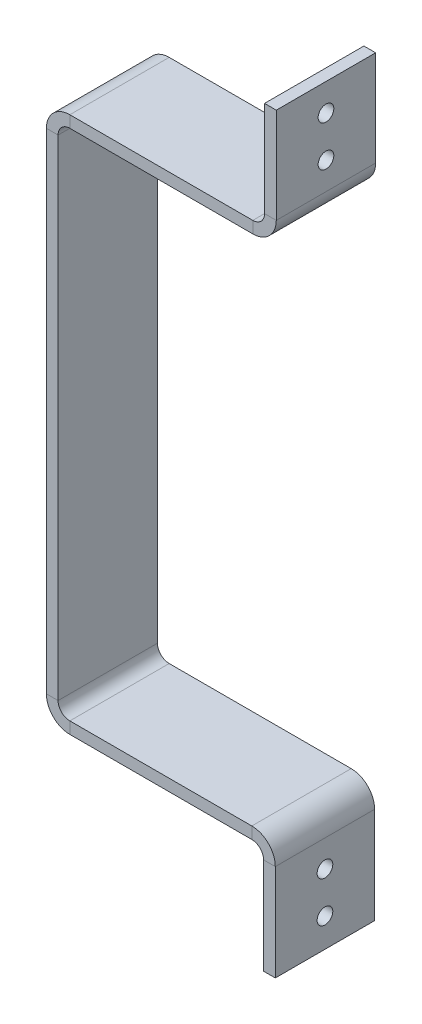
ISO-10303-21;
HEADER;
FILE_DESCRIPTION(('STEP AP214'),'2;1');
FILE_NAME('part.step','',(''),(''),'','','');
FILE_SCHEMA(('AUTOMOTIVE_DESIGN { 1 0 10303 214 1 1 1 1 }'));
ENDSEC;
DATA;
#1=APPLICATION_CONTEXT('core data for automotive mechanical design processes');
#2=APPLICATION_PROTOCOL_DEFINITION('international standard','automotive_design',2000,#1);
#3=PRODUCT_CONTEXT('',#1,'mechanical');
#4=PRODUCT('Part','Part','',(#3));
#5=PRODUCT_RELATED_PRODUCT_CATEGORY('part','',(#4));
#6=PRODUCT_DEFINITION_FORMATION('','',#4);
#7=PRODUCT_DEFINITION_CONTEXT('part definition',#1,'design');
#8=PRODUCT_DEFINITION('design','',#6,#7);
#9=PRODUCT_DEFINITION_SHAPE('','',#8);
#10=(LENGTH_UNIT() NAMED_UNIT(*) SI_UNIT(.MILLI.,.METRE.));
#11=(NAMED_UNIT(*) PLANE_ANGLE_UNIT() SI_UNIT($,.RADIAN.));
#12=(NAMED_UNIT(*) SI_UNIT($,.STERADIAN.) SOLID_ANGLE_UNIT());
#13=UNCERTAINTY_MEASURE_WITH_UNIT(LENGTH_MEASURE(1.E-05),#10,'distance_accuracy_value','');
#14=(GEOMETRIC_REPRESENTATION_CONTEXT(3) GLOBAL_UNCERTAINTY_ASSIGNED_CONTEXT((#13)) GLOBAL_UNIT_ASSIGNED_CONTEXT((#10,
#11,#12)) REPRESENTATION_CONTEXT('',''));
#15=CARTESIAN_POINT('',(0.,0.,0.));
#16=DIRECTION('',(0.,0.,1.));
#17=DIRECTION('',(1.,0.,0.));
#18=AXIS2_PLACEMENT_3D('',#15,#16,#17);
#19=CARTESIAN_POINT('',(0.,0.,0.));
#20=DIRECTION('',(0.,1.,0.));
#21=DIRECTION('',(0.,0.,1.));
#22=AXIS2_PLACEMENT_3D('',#19,#20,#21);
#23=PLANE('',#22);
#24=DIRECTION('',(1.,0.,0.));
#25=VECTOR('',#24,1.);
#26=CARTESIAN_POINT('',(0.,0.,-12.7));
#27=LINE('',#26,#25);
#28=CARTESIAN_POINT('',(116.191708264711,0.,-12.7));
#29=VERTEX_POINT('',#28);
#30=CARTESIAN_POINT('',(69.6662917352885,0.,-12.7));
#31=VERTEX_POINT('',#30);
#32=EDGE_CURVE('E90',#29,#31,#27,.F.);
#33=ORIENTED_EDGE('',*,*,#32,.F.);
#34=DIRECTION('',(0.,0.,1.));
#35=VECTOR('',#34,1.);
#36=CARTESIAN_POINT('',(116.191708264711,0.,0.));
#37=LINE('',#36,#35);
#38=CARTESIAN_POINT('',(116.191708264711,0.,12.7));
#39=VERTEX_POINT('',#38);
#40=EDGE_CURVE('E82',#29,#39,#37,.T.);
#41=ORIENTED_EDGE('',*,*,#40,.T.);
#42=DIRECTION('',(1.,0.,0.));
#43=VECTOR('',#42,1.);
#44=CARTESIAN_POINT('',(0.,0.,12.7));
#45=LINE('',#44,#43);
#46=CARTESIAN_POINT('',(69.6662917352885,0.,12.7));
#47=VERTEX_POINT('',#46);
#48=EDGE_CURVE('E98',#47,#39,#45,.T.);
#49=ORIENTED_EDGE('',*,*,#48,.F.);
#50=DIRECTION('',(0.,0.,1.));
#51=VECTOR('',#50,1.);
#52=CARTESIAN_POINT('',(69.6662917352885,0.,0.));
#53=LINE('',#52,#51);
#54=EDGE_CURVE('E274',#31,#47,#53,.T.);
#55=ORIENTED_EDGE('',*,*,#54,.F.);
#56=EDGE_LOOP('',(#33,#41,#49,#55));
#57=FACE_BOUND('',#56,.T.);
#58=ADVANCED_FACE('F72',(#57),#23,.F.);
#59=CARTESIAN_POINT('',(63.6662917352887,68.5977082647114,0.));
#60=DIRECTION('',(1.,0.,0.));
#61=DIRECTION('',(0.,0.,1.));
#62=AXIS2_PLACEMENT_3D('',#59,#60,#61);
#63=PLANE('',#62);
#64=DIRECTION('',(0.,-1.,0.));
#65=VECTOR('',#64,1.);
#66=CARTESIAN_POINT('',(63.6662917352887,68.5977082647114,-12.7));
#67=LINE('',#66,#65);
#68=CARTESIAN_POINT('',(63.6662917352885,6.00000000000002,-12.7));
#69=VERTEX_POINT('',#68);
#70=CARTESIAN_POINT('',(63.6662917352889,131.195416529423,-12.7));
#71=VERTEX_POINT('',#70);
#72=EDGE_CURVE('E374',#69,#71,#67,.F.);
#73=ORIENTED_EDGE('',*,*,#72,.F.);
#74=DIRECTION('',(0.,0.,1.));
#75=VECTOR('',#74,1.);
#76=CARTESIAN_POINT('',(63.6662917352885,6.00000000000002,0.));
#77=LINE('',#76,#75);
#78=CARTESIAN_POINT('',(63.6662917352885,6.00000000000002,12.7));
#79=VERTEX_POINT('',#78);
#80=EDGE_CURVE('E441',#69,#79,#77,.T.);
#81=ORIENTED_EDGE('',*,*,#80,.T.);
#82=DIRECTION('',(0.,-1.,0.));
#83=VECTOR('',#82,1.);
#84=CARTESIAN_POINT('',(63.6662917352887,68.5977082647114,12.7));
#85=LINE('',#84,#83);
#86=CARTESIAN_POINT('',(63.6662917352889,131.195416529423,12.7));
#87=VERTEX_POINT('',#86);
#88=EDGE_CURVE('E375',#87,#79,#85,.T.);
#89=ORIENTED_EDGE('',*,*,#88,.F.);
#90=DIRECTION('',(0.,0.,-1.));
#91=VECTOR('',#90,1.);
#92=CARTESIAN_POINT('',(63.6662917352889,131.195416529423,0.));
#93=LINE('',#92,#91);
#94=EDGE_CURVE('E370',#87,#71,#93,.T.);
#95=ORIENTED_EDGE('',*,*,#94,.T.);
#96=EDGE_LOOP('',(#73,#81,#89,#95));
#97=FACE_BOUND('',#96,.T.);
#98=ADVANCED_FACE('F568',(#97),#63,.F.);
#99=CARTESIAN_POINT('',(147.92,134.195416529422,12.7));
#100=DIRECTION('',(0.,0.,1.));
#101=DIRECTION('',(-1.,0.,0.));
#102=AXIS2_PLACEMENT_3D('',#99,#100,#101);
#103=PLANE('',#102);
#104=DIRECTION('',(-1.,0.,0.));
#105=VECTOR('',#104,1.);
#106=CARTESIAN_POINT('',(147.92,134.195416529422,12.7));
#107=LINE('',#106,#105);
#108=CARTESIAN_POINT('',(116.445708264712,134.195416529423,12.7));
#109=VERTEX_POINT('',#108);
#110=CARTESIAN_POINT('',(69.6662917352889,134.195416529423,12.7));
#111=VERTEX_POINT('',#110);
#112=EDGE_CURVE('E393',#109,#111,#107,.T.);
#113=ORIENTED_EDGE('',*,*,#112,.F.);
#114=DIRECTION('',(0.,1.,0.));
#115=VECTOR('',#114,1.);
#116=CARTESIAN_POINT('',(116.445708264712,134.195416529423,12.7));
#117=LINE('',#116,#115);
#118=CARTESIAN_POINT('',(116.445708264712,137.195416529423,12.7));
#119=VERTEX_POINT('',#118);
#120=EDGE_CURVE('E416',#109,#119,#117,.T.);
#121=ORIENTED_EDGE('',*,*,#120,.T.);
#122=DIRECTION('',(-1.,0.,0.));
#123=VECTOR('',#122,1.);
#124=CARTESIAN_POINT('',(3.7470027081099E-13,137.195416529423,12.7));
#125=LINE('',#124,#123);
#126=CARTESIAN_POINT('',(69.6662917352889,137.195416529423,12.7));
#127=VERTEX_POINT('',#126);
#128=EDGE_CURVE('E421',#119,#127,#125,.T.);
#129=ORIENTED_EDGE('',*,*,#128,.T.);
#130=DIRECTION('',(0.,-1.,0.));
#131=VECTOR('',#130,1.);
#132=CARTESIAN_POINT('',(69.6662917352889,134.195416529423,12.7));
#133=LINE('',#132,#131);
#134=EDGE_CURVE('E392',#127,#111,#133,.T.);
#135=ORIENTED_EDGE('',*,*,#134,.T.);
#136=EDGE_LOOP('',(#113,#121,#129,#135));
#137=FACE_BOUND('',#136,.T.);
#138=ADVANCED_FACE('F623',(#137),#103,.T.);
#139=CARTESIAN_POINT('',(147.92,134.195416529422,-12.7));
#140=DIRECTION('',(0.,0.,-1.));
#141=DIRECTION('',(1.,0.,0.));
#142=AXIS2_PLACEMENT_3D('',#139,#140,#141);
#143=PLANE('',#142);
#144=DIRECTION('',(-1.,0.,0.));
#145=VECTOR('',#144,1.);
#146=CARTESIAN_POINT('',(3.7470027081099E-13,137.195416529423,-12.7));
#147=LINE('',#146,#145);
#148=CARTESIAN_POINT('',(69.6662917352889,137.195416529423,-12.7));
#149=VERTEX_POINT('',#148);
#150=CARTESIAN_POINT('',(116.445708264712,137.195416529423,-12.7));
#151=VERTEX_POINT('',#150);
#152=EDGE_CURVE('E425',#149,#151,#147,.F.);
#153=ORIENTED_EDGE('',*,*,#152,.T.);
#154=DIRECTION('',(0.,-1.,0.));
#155=VECTOR('',#154,1.);
#156=CARTESIAN_POINT('',(116.445708264712,134.195416529423,-12.7));
#157=LINE('',#156,#155);
#158=CARTESIAN_POINT('',(116.445708264712,134.195416529423,-12.7));
#159=VERTEX_POINT('',#158);
#160=EDGE_CURVE('E408',#151,#159,#157,.T.);
#161=ORIENTED_EDGE('',*,*,#160,.T.);
#162=DIRECTION('',(1.,0.,0.));
#163=VECTOR('',#162,1.);
#164=CARTESIAN_POINT('',(147.92,134.195416529422,-12.7));
#165=LINE('',#164,#163);
#166=CARTESIAN_POINT('',(69.6662917352889,134.195416529423,-12.7));
#167=VERTEX_POINT('',#166);
#168=EDGE_CURVE('E424',#167,#159,#165,.T.);
#169=ORIENTED_EDGE('',*,*,#168,.F.);
#170=DIRECTION('',(0.,1.,0.));
#171=VECTOR('',#170,1.);
#172=CARTESIAN_POINT('',(69.6662917352889,134.195416529423,-12.7));
#173=LINE('',#172,#171);
#174=EDGE_CURVE('E400',#167,#149,#173,.T.);
#175=ORIENTED_EDGE('',*,*,#174,.T.);
#176=EDGE_LOOP('',(#153,#161,#169,#175));
#177=FACE_BOUND('',#176,.T.);
#178=ADVANCED_FACE('F593',(#177),#143,.T.);
#179=CARTESIAN_POINT('',(3.60822483003176E-13,134.195416529423,0.));
#180=DIRECTION('',(0.,-1.,0.));
#181=DIRECTION('',(0.,0.,1.));
#182=AXIS2_PLACEMENT_3D('',#179,#180,#181);
#183=PLANE('',#182);
#184=ORIENTED_EDGE('',*,*,#168,.T.);
#185=DIRECTION('',(0.,0.,1.));
#186=VECTOR('',#185,1.);
#187=CARTESIAN_POINT('',(116.445708264712,134.195416529423,0.));
#188=LINE('',#187,#186);
#189=EDGE_CURVE('E404',#159,#109,#188,.T.);
#190=ORIENTED_EDGE('',*,*,#189,.T.);
#191=ORIENTED_EDGE('',*,*,#112,.T.);
#192=DIRECTION('',(0.,0.,-1.));
#193=VECTOR('',#192,1.);
#194=CARTESIAN_POINT('',(69.6662917352889,134.195416529423,0.));
#195=LINE('',#194,#193);
#196=EDGE_CURVE('E388',#111,#167,#195,.T.);
#197=ORIENTED_EDGE('',*,*,#196,.T.);
#198=EDGE_LOOP('',(#184,#190,#191,#197));
#199=FACE_BOUND('',#198,.T.);
#200=ADVANCED_FACE('F590',(#199),#183,.T.);
#201=CARTESIAN_POINT('',(3.7470027081099E-13,137.195416529423,0.));
#202=DIRECTION('',(0.,-1.,0.));
#203=DIRECTION('',(0.,0.,1.));
#204=AXIS2_PLACEMENT_3D('',#201,#202,#203);
#205=PLANE('',#204);
#206=DIRECTION('',(0.,0.,1.));
#207=VECTOR('',#206,1.);
#208=CARTESIAN_POINT('',(116.445708264712,137.195416529423,0.));
#209=LINE('',#208,#207);
#210=EDGE_CURVE('E412',#151,#119,#209,.T.);
#211=ORIENTED_EDGE('',*,*,#210,.F.);
#212=ORIENTED_EDGE('',*,*,#152,.F.);
#213=DIRECTION('',(0.,0.,-1.));
#214=VECTOR('',#213,1.);
#215=CARTESIAN_POINT('',(69.666291735289,137.195416529423,0.));
#216=LINE('',#215,#214);
#217=EDGE_CURVE('E397',#127,#149,#216,.T.);
#218=ORIENTED_EDGE('',*,*,#217,.F.);
#219=ORIENTED_EDGE('',*,*,#128,.F.);
#220=EDGE_LOOP('',(#211,#212,#218,#219));
#221=FACE_BOUND('',#220,.T.);
#222=ADVANCED_FACE('F629',(#221),#205,.F.);
#223=CARTESIAN_POINT('',(66.6662917352887,68.5977082647114,0.));
#224=DIRECTION('',(1.,0.,0.));
#225=DIRECTION('',(0.,0.,1.));
#226=AXIS2_PLACEMENT_3D('',#223,#224,#225);
#227=PLANE('',#226);
#228=DIRECTION('',(0.,0.,1.));
#229=VECTOR('',#228,1.);
#230=CARTESIAN_POINT('',(66.6662917352885,6.00000000000001,0.));
#231=LINE('',#230,#229);
#232=CARTESIAN_POINT('',(66.6662917352885,6.00000000000001,-12.7));
#233=VERTEX_POINT('',#232);
#234=CARTESIAN_POINT('',(66.6662917352885,6.,12.7));
#235=VERTEX_POINT('',#234);
#236=EDGE_CURVE('E420',#233,#235,#231,.T.);
#237=ORIENTED_EDGE('',*,*,#236,.F.);
#238=DIRECTION('',(0.,1.,0.));
#239=VECTOR('',#238,1.);
#240=CARTESIAN_POINT('',(66.6662917352892,216.517708264712,-12.7));
#241=LINE('',#240,#239);
#242=CARTESIAN_POINT('',(66.6662917352889,131.195416529423,-12.7));
#243=VERTEX_POINT('',#242);
#244=EDGE_CURVE('E454',#233,#243,#241,.T.);
#245=ORIENTED_EDGE('',*,*,#244,.T.);
#246=DIRECTION('',(0.,0.,-1.));
#247=VECTOR('',#246,1.);
#248=CARTESIAN_POINT('',(66.6662917352889,131.195416529423,0.));
#249=LINE('',#248,#247);
#250=CARTESIAN_POINT('',(66.6662917352889,131.195416529423,12.7));
#251=VERTEX_POINT('',#250);
#252=EDGE_CURVE('E363',#251,#243,#249,.T.);
#253=ORIENTED_EDGE('',*,*,#252,.F.);
#254=DIRECTION('',(0.,-1.,0.));
#255=VECTOR('',#254,1.);
#256=CARTESIAN_POINT('',(66.6662917352892,216.517708264712,12.7));
#257=LINE('',#256,#255);
#258=EDGE_CURVE('E380',#251,#235,#257,.T.);
#259=ORIENTED_EDGE('',*,*,#258,.T.);
#260=EDGE_LOOP('',(#237,#245,#253,#259));
#261=FACE_BOUND('',#260,.T.);
#262=ADVANCED_FACE('F576',(#261),#227,.T.);
#263=CARTESIAN_POINT('',(66.6662917352892,216.517708264712,12.7));
#264=DIRECTION('',(0.,0.,1.));
#265=DIRECTION('',(0.,-1.,0.));
#266=AXIS2_PLACEMENT_3D('',#263,#264,#265);
#267=PLANE('',#266);
#268=DIRECTION('',(-1.,0.,0.));
#269=VECTOR('',#268,1.);
#270=CARTESIAN_POINT('',(66.6662917352885,6.00000000000001,12.7));
#271=LINE('',#270,#269);
#272=EDGE_CURVE('E437',#235,#79,#271,.T.);
#273=ORIENTED_EDGE('',*,*,#272,.F.);
#274=ORIENTED_EDGE('',*,*,#258,.F.);
#275=DIRECTION('',(1.,0.,0.));
#276=VECTOR('',#275,1.);
#277=CARTESIAN_POINT('',(66.6662917352889,131.195416529423,12.7));
#278=LINE('',#277,#276);
#279=EDGE_CURVE('E376',#87,#251,#278,.T.);
#280=ORIENTED_EDGE('',*,*,#279,.F.);
#281=ORIENTED_EDGE('',*,*,#88,.T.);
#282=EDGE_LOOP('',(#273,#274,#280,#281));
#283=FACE_BOUND('',#282,.T.);
#284=ADVANCED_FACE('F573',(#283),#267,.T.);
#285=CARTESIAN_POINT('',(66.6662917352892,216.517708264712,-12.7));
#286=DIRECTION('',(0.,0.,-1.));
#287=DIRECTION('',(0.,1.,0.));
#288=AXIS2_PLACEMENT_3D('',#285,#286,#287);
#289=PLANE('',#288);
#290=DIRECTION('',(1.,0.,0.));
#291=VECTOR('',#290,1.);
#292=CARTESIAN_POINT('',(66.6662917352885,6.00000000000001,-12.7));
#293=LINE('',#292,#291);
#294=EDGE_CURVE('E445',#69,#233,#293,.T.);
#295=ORIENTED_EDGE('',*,*,#294,.F.);
#296=ORIENTED_EDGE('',*,*,#72,.T.);
#297=DIRECTION('',(-1.,0.,0.));
#298=VECTOR('',#297,1.);
#299=CARTESIAN_POINT('',(66.6662917352889,131.195416529423,-12.7));
#300=LINE('',#299,#298);
#301=EDGE_CURVE('E381',#243,#71,#300,.T.);
#302=ORIENTED_EDGE('',*,*,#301,.F.);
#303=ORIENTED_EDGE('',*,*,#244,.F.);
#304=EDGE_LOOP('',(#295,#296,#302,#303));
#305=FACE_BOUND('',#304,.T.);
#306=ADVANCED_FACE('F562',(#305),#289,.T.);
#307=CARTESIAN_POINT('',(69.6662917352889,131.195416529423,12.7));
#308=DIRECTION('',(0.,0.,-1.));
#309=DIRECTION('',(0.,1.,0.));
#310=AXIS2_PLACEMENT_3D('',#307,#308,#309);
#311=PLANE('',#310);
#312=ORIENTED_EDGE('',*,*,#134,.F.);
#313=CARTESIAN_POINT('',(69.6662917352889,131.195416529423,12.7));
#314=DIRECTION('',(0.,0.,1.));
#315=DIRECTION('',(0.,-1.,0.));
#316=AXIS2_PLACEMENT_3D('',#313,#314,#315);
#317=CIRCLE('',#316,6.);
#318=EDGE_CURVE('E349',#127,#87,#317,.T.);
#319=ORIENTED_EDGE('',*,*,#318,.T.);
#320=ORIENTED_EDGE('',*,*,#279,.T.);
#321=CARTESIAN_POINT('',(69.6662917352889,131.195416529423,12.7));
#322=DIRECTION('',(0.,0.,1.));
#323=DIRECTION('',(0.,-1.,0.));
#324=AXIS2_PLACEMENT_3D('',#321,#322,#323);
#325=CIRCLE('',#324,3.);
#326=EDGE_CURVE('E355',#111,#251,#325,.T.);
#327=ORIENTED_EDGE('',*,*,#326,.F.);
#328=EDGE_LOOP('',(#312,#319,#320,#327));
#329=FACE_BOUND('',#328,.T.);
#330=ADVANCED_FACE('F582',(#329),#311,.F.);
#331=CARTESIAN_POINT('',(69.6662917352889,131.195416529423,-12.7));
#332=DIRECTION('',(0.,0.,1.));
#333=DIRECTION('',(0.,-1.,0.));
#334=AXIS2_PLACEMENT_3D('',#331,#332,#333);
#335=PLANE('',#334);
#336=CARTESIAN_POINT('',(69.6662917352889,131.195416529423,-12.7));
#337=DIRECTION('',(0.,0.,1.));
#338=DIRECTION('',(0.,-1.,0.));
#339=AXIS2_PLACEMENT_3D('',#336,#337,#338);
#340=CIRCLE('',#339,6.);
#341=EDGE_CURVE('E360',#71,#149,#340,.F.);
#342=ORIENTED_EDGE('',*,*,#341,.T.);
#343=ORIENTED_EDGE('',*,*,#174,.F.);
#344=CARTESIAN_POINT('',(69.6662917352889,131.195416529423,-12.7));
#345=DIRECTION('',(0.,0.,-1.));
#346=DIRECTION('',(0.,1.,0.));
#347=AXIS2_PLACEMENT_3D('',#344,#345,#346);
#348=CIRCLE('',#347,3.);
#349=EDGE_CURVE('E359',#243,#167,#348,.T.);
#350=ORIENTED_EDGE('',*,*,#349,.F.);
#351=ORIENTED_EDGE('',*,*,#301,.T.);
#352=EDGE_LOOP('',(#342,#343,#350,#351));
#353=FACE_BOUND('',#352,.T.);
#354=ADVANCED_FACE('F660',(#353),#335,.F.);
#355=CARTESIAN_POINT('',(69.6662917352889,131.195416529423,-26.5353513690796));
#356=DIRECTION('',(0.,0.,1.));
#357=DIRECTION('',(0.,-1.,0.));
#358=AXIS2_PLACEMENT_3D('',#355,#356,#357);
#359=CYLINDRICAL_SURFACE('',#358,3.);
#360=ORIENTED_EDGE('',*,*,#252,.T.);
#361=ORIENTED_EDGE('',*,*,#349,.T.);
#362=ORIENTED_EDGE('',*,*,#196,.F.);
#363=ORIENTED_EDGE('',*,*,#326,.T.);
#364=EDGE_LOOP('',(#360,#361,#362,#363));
#365=FACE_BOUND('',#364,.T.);
#366=ADVANCED_FACE('F586',(#365),#359,.F.);
#367=CARTESIAN_POINT('',(69.6662917352889,131.195416529423,-26.5353513690796));
#368=DIRECTION('',(0.,0.,1.));
#369=DIRECTION('',(0.,-1.,0.));
#370=AXIS2_PLACEMENT_3D('',#367,#368,#369);
#371=CYLINDRICAL_SURFACE('',#370,6.);
#372=ORIENTED_EDGE('',*,*,#94,.F.);
#373=ORIENTED_EDGE('',*,*,#318,.F.);
#374=ORIENTED_EDGE('',*,*,#217,.T.);
#375=ORIENTED_EDGE('',*,*,#341,.F.);
#376=EDGE_LOOP('',(#372,#373,#374,#375));
#377=FACE_BOUND('',#376,.T.);
#378=ADVANCED_FACE('F626',(#377),#371,.T.);
#379=CARTESIAN_POINT('',(116.445708264712,140.195416529423,-12.7));
#380=DIRECTION('',(0.,0.,-1.));
#381=DIRECTION('',(0.,1.,0.));
#382=AXIS2_PLACEMENT_3D('',#379,#380,#381);
#383=PLANE('',#382);
#384=ORIENTED_EDGE('',*,*,#160,.F.);
#385=CARTESIAN_POINT('',(116.445708264712,140.195416529423,-12.7));
#386=DIRECTION('',(0.,0.,1.));
#387=DIRECTION('',(0.,-1.,0.));
#388=AXIS2_PLACEMENT_3D('',#385,#386,#387);
#389=CIRCLE('',#388,3.);
#390=CARTESIAN_POINT('',(119.445708264712,140.195416529423,-12.7));
#391=VERTEX_POINT('',#390);
#392=EDGE_CURVE('E300',#151,#391,#389,.T.);
#393=ORIENTED_EDGE('',*,*,#392,.T.);
#394=DIRECTION('',(1.,0.,0.));
#395=VECTOR('',#394,1.);
#396=CARTESIAN_POINT('',(122.445708264712,140.195416529423,-12.7));
#397=LINE('',#396,#395);
#398=CARTESIAN_POINT('',(122.445708264712,140.195416529423,-12.7));
#399=VERTEX_POINT('',#398);
#400=EDGE_CURVE('E329',#391,#399,#397,.T.);
#401=ORIENTED_EDGE('',*,*,#400,.T.);
#402=CARTESIAN_POINT('',(116.445708264712,140.195416529423,-12.7));
#403=DIRECTION('',(0.,0.,1.));
#404=DIRECTION('',(0.,-1.,0.));
#405=AXIS2_PLACEMENT_3D('',#402,#403,#404);
#406=CIRCLE('',#405,6.);
#407=EDGE_CURVE('E340',#159,#399,#406,.T.);
#408=ORIENTED_EDGE('',*,*,#407,.F.);
#409=EDGE_LOOP('',(#384,#393,#401,#408));
#410=FACE_BOUND('',#409,.T.);
#411=ADVANCED_FACE('F599',(#410),#383,.T.);
#412=CARTESIAN_POINT('',(116.445708264712,140.195416529423,12.7));
#413=DIRECTION('',(0.,0.,1.));
#414=DIRECTION('',(0.,-1.,0.));
#415=AXIS2_PLACEMENT_3D('',#412,#413,#414);
#416=PLANE('',#415);
#417=CARTESIAN_POINT('',(116.445708264712,140.195416529423,12.7));
#418=DIRECTION('',(0.,0.,1.));
#419=DIRECTION('',(0.,-1.,0.));
#420=AXIS2_PLACEMENT_3D('',#417,#418,#419);
#421=CIRCLE('',#420,3.);
#422=CARTESIAN_POINT('',(119.445708264712,140.195416529423,12.7));
#423=VERTEX_POINT('',#422);
#424=EDGE_CURVE('E345',#423,#119,#421,.F.);
#425=ORIENTED_EDGE('',*,*,#424,.T.);
#426=ORIENTED_EDGE('',*,*,#120,.F.);
#427=CARTESIAN_POINT('',(116.445708264712,140.195416529423,12.7));
#428=DIRECTION('',(0.,0.,-1.));
#429=DIRECTION('',(0.,1.,0.));
#430=AXIS2_PLACEMENT_3D('',#427,#428,#429);
#431=CIRCLE('',#430,6.);
#432=CARTESIAN_POINT('',(122.445708264712,140.195416529423,12.7));
#433=VERTEX_POINT('',#432);
#434=EDGE_CURVE('E344',#433,#109,#431,.T.);
#435=ORIENTED_EDGE('',*,*,#434,.F.);
#436=DIRECTION('',(-1.,0.,0.));
#437=VECTOR('',#436,1.);
#438=CARTESIAN_POINT('',(122.445708264712,140.195416529423,12.7));
#439=LINE('',#438,#437);
#440=EDGE_CURVE('E333',#433,#423,#439,.T.);
#441=ORIENTED_EDGE('',*,*,#440,.T.);
#442=EDGE_LOOP('',(#425,#426,#435,#441));
#443=FACE_BOUND('',#442,.T.);
#444=ADVANCED_FACE('F612',(#443),#416,.T.);
#445=CARTESIAN_POINT('',(116.445708264712,140.195416529423,-26.5353513690796));
#446=DIRECTION('',(0.,0.,1.));
#447=DIRECTION('',(0.,-1.,0.));
#448=AXIS2_PLACEMENT_3D('',#445,#446,#447);
#449=CYLINDRICAL_SURFACE('',#448,6.);
#450=DIRECTION('',(0.,0.,1.));
#451=VECTOR('',#450,1.);
#452=CARTESIAN_POINT('',(122.445708264712,140.195416529423,0.));
#453=LINE('',#452,#451);
#454=EDGE_CURVE('E284',#399,#433,#453,.T.);
#455=ORIENTED_EDGE('',*,*,#454,.T.);
#456=ORIENTED_EDGE('',*,*,#434,.T.);
#457=ORIENTED_EDGE('',*,*,#189,.F.);
#458=ORIENTED_EDGE('',*,*,#407,.T.);
#459=EDGE_LOOP('',(#455,#456,#457,#458));
#460=FACE_BOUND('',#459,.T.);
#461=ADVANCED_FACE('F621',(#460),#449,.T.);
#462=CARTESIAN_POINT('',(116.445708264712,140.195416529423,-26.5353513690796));
#463=DIRECTION('',(0.,0.,1.));
#464=DIRECTION('',(0.,-1.,0.));
#465=AXIS2_PLACEMENT_3D('',#462,#463,#464);
#466=CYLINDRICAL_SURFACE('',#465,3.);
#467=DIRECTION('',(0.,0.,1.));
#468=VECTOR('',#467,1.);
#469=CARTESIAN_POINT('',(119.445708264712,140.195416529423,0.));
#470=LINE('',#469,#468);
#471=EDGE_CURVE('E301',#391,#423,#470,.T.);
#472=ORIENTED_EDGE('',*,*,#471,.F.);
#473=ORIENTED_EDGE('',*,*,#392,.F.);
#474=ORIENTED_EDGE('',*,*,#210,.T.);
#475=ORIENTED_EDGE('',*,*,#424,.F.);
#476=EDGE_LOOP('',(#472,#473,#474,#475));
#477=FACE_BOUND('',#476,.T.);
#478=ADVANCED_FACE('F602',(#477),#466,.F.);
#479=CARTESIAN_POINT('',(122.445708264712,164.601124794134,-12.7));
#480=DIRECTION('',(0.,1.,0.));
#481=DIRECTION('',(0.,0.,1.));
#482=AXIS2_PLACEMENT_3D('',#479,#480,#481);
#483=PLANE('',#482);
#484=DIRECTION('',(1.,0.,0.));
#485=VECTOR('',#484,1.);
#486=CARTESIAN_POINT('',(122.445708264712,164.601124794134,-12.7));
#487=LINE('',#486,#485);
#488=CARTESIAN_POINT('',(119.445708264712,164.601124794134,-12.7));
#489=VERTEX_POINT('',#488);
#490=CARTESIAN_POINT('',(122.445708264712,164.601124794134,-12.7));
#491=VERTEX_POINT('',#490);
#492=EDGE_CURVE('E305',#489,#491,#487,.T.);
#493=ORIENTED_EDGE('',*,*,#492,.F.);
#494=DIRECTION('',(0.,0.,1.));
#495=VECTOR('',#494,1.);
#496=CARTESIAN_POINT('',(119.445708264712,164.601124794134,0.));
#497=LINE('',#496,#495);
#498=CARTESIAN_POINT('',(119.445708264712,164.601124794134,12.7));
#499=VERTEX_POINT('',#498);
#500=EDGE_CURVE('E325',#489,#499,#497,.T.);
#501=ORIENTED_EDGE('',*,*,#500,.T.);
#502=DIRECTION('',(1.,0.,0.));
#503=VECTOR('',#502,1.);
#504=CARTESIAN_POINT('',(122.445708264712,164.601124794134,12.7));
#505=LINE('',#504,#503);
#506=CARTESIAN_POINT('',(122.445708264712,164.601124794134,12.7));
#507=VERTEX_POINT('',#506);
#508=EDGE_CURVE('E322',#499,#507,#505,.T.);
#509=ORIENTED_EDGE('',*,*,#508,.T.);
#510=DIRECTION('',(0.,0.,1.));
#511=VECTOR('',#510,1.);
#512=CARTESIAN_POINT('',(122.445708264712,164.601124794134,-12.7));
#513=LINE('',#512,#511);
#514=EDGE_CURVE('E316',#491,#507,#513,.T.);
#515=ORIENTED_EDGE('',*,*,#514,.F.);
#516=EDGE_LOOP('',(#493,#501,#509,#515));
#517=FACE_BOUND('',#516,.T.);
#518=ADVANCED_FACE('F676',(#517),#483,.T.);
#519=CARTESIAN_POINT('',(122.445708264711,16.6811247941341,0.));
#520=DIRECTION('',(1.,0.,0.));
#521=DIRECTION('',(0.,0.,1.));
#522=AXIS2_PLACEMENT_3D('',#519,#520,#521);
#523=PLANE('',#522);
#524=CARTESIAN_POINT('',(122.445708264712,157.601124794134,0.));
#525=DIRECTION('',(1.,0.,0.));
#526=DIRECTION('',(0.,1.,0.));
#527=AXIS2_PLACEMENT_3D('',#524,#525,#526);
#528=CIRCLE('',#527,2.);
#529=CARTESIAN_POINT('',(122.445708264712,159.601124794134,0.));
#530=VERTEX_POINT('',#529);
#531=EDGE_CURVE('E245',#530,#530,#528,.T.);
#532=ORIENTED_EDGE('',*,*,#531,.F.);
#533=EDGE_LOOP('',(#532));
#534=FACE_BOUND('',#533,.T.);
#535=CARTESIAN_POINT('',(122.445708264712,147.195416529423,0.));
#536=DIRECTION('',(1.,0.,0.));
#537=DIRECTION('',(0.,1.,0.));
#538=AXIS2_PLACEMENT_3D('',#535,#536,#537);
#539=CIRCLE('',#538,2.);
#540=CARTESIAN_POINT('',(122.445708264712,149.195416529423,0.));
#541=VERTEX_POINT('',#540);
#542=EDGE_CURVE('E489',#541,#541,#539,.T.);
#543=ORIENTED_EDGE('',*,*,#542,.F.);
#544=EDGE_LOOP('',(#543));
#545=FACE_BOUND('',#544,.T.);
#546=ORIENTED_EDGE('',*,*,#454,.F.);
#547=DIRECTION('',(0.,1.,0.));
#548=VECTOR('',#547,1.);
#549=CARTESIAN_POINT('',(122.445708264712,164.601124794134,-12.7));
#550=LINE('',#549,#548);
#551=EDGE_CURVE('E320',#399,#491,#550,.T.);
#552=ORIENTED_EDGE('',*,*,#551,.T.);
#553=ORIENTED_EDGE('',*,*,#514,.T.);
#554=DIRECTION('',(0.,-1.,0.));
#555=VECTOR('',#554,1.);
#556=CARTESIAN_POINT('',(122.445708264712,164.601124794134,12.7));
#557=LINE('',#556,#555);
#558=EDGE_CURVE('E312',#507,#433,#557,.T.);
#559=ORIENTED_EDGE('',*,*,#558,.T.);
#560=EDGE_LOOP('',(#546,#552,#553,#559));
#561=FACE_BOUND('',#560,.T.);
#562=ADVANCED_FACE('F617',(#534,#545,#561),#523,.T.);
#563=CARTESIAN_POINT('',(122.445708264712,164.601124794134,-12.7));
#564=DIRECTION('',(0.,0.,-1.));
#565=DIRECTION('',(0.,1.,0.));
#566=AXIS2_PLACEMENT_3D('',#563,#564,#565);
#567=PLANE('',#566);
#568=ORIENTED_EDGE('',*,*,#400,.F.);
#569=DIRECTION('',(0.,-1.,0.));
#570=VECTOR('',#569,1.);
#571=CARTESIAN_POINT('',(119.445708264711,16.6811247941342,-12.7));
#572=LINE('',#571,#570);
#573=EDGE_CURVE('E309',#391,#489,#572,.F.);
#574=ORIENTED_EDGE('',*,*,#573,.T.);
#575=ORIENTED_EDGE('',*,*,#492,.T.);
#576=ORIENTED_EDGE('',*,*,#551,.F.);
#577=EDGE_LOOP('',(#568,#574,#575,#576));
#578=FACE_BOUND('',#577,.T.);
#579=ADVANCED_FACE('F683',(#578),#567,.T.);
#580=CARTESIAN_POINT('',(119.445708264711,16.6811247941342,0.));
#581=DIRECTION('',(1.,0.,0.));
#582=DIRECTION('',(0.,0.,1.));
#583=AXIS2_PLACEMENT_3D('',#580,#581,#582);
#584=PLANE('',#583);
#585=CARTESIAN_POINT('',(119.445708264712,157.601124794134,0.));
#586=DIRECTION('',(1.,0.,0.));
#587=DIRECTION('',(0.,1.,0.));
#588=AXIS2_PLACEMENT_3D('',#585,#586,#587);
#589=CIRCLE('',#588,2.);
#590=CARTESIAN_POINT('',(119.445708264712,159.601124794134,0.));
#591=VERTEX_POINT('',#590);
#592=EDGE_CURVE('E76',#591,#591,#589,.T.);
#593=ORIENTED_EDGE('',*,*,#592,.T.);
#594=EDGE_LOOP('',(#593));
#595=FACE_BOUND('',#594,.T.);
#596=CARTESIAN_POINT('',(119.445708264712,147.195416529423,0.));
#597=DIRECTION('',(1.,0.,0.));
#598=DIRECTION('',(0.,1.,0.));
#599=AXIS2_PLACEMENT_3D('',#596,#597,#598);
#600=CIRCLE('',#599,2.);
#601=CARTESIAN_POINT('',(119.445708264712,149.195416529423,0.));
#602=VERTEX_POINT('',#601);
#603=EDGE_CURVE('E486',#602,#602,#600,.T.);
#604=ORIENTED_EDGE('',*,*,#603,.T.);
#605=EDGE_LOOP('',(#604));
#606=FACE_BOUND('',#605,.T.);
#607=ORIENTED_EDGE('',*,*,#573,.F.);
#608=ORIENTED_EDGE('',*,*,#471,.T.);
#609=DIRECTION('',(0.,-1.,0.));
#610=VECTOR('',#609,1.);
#611=CARTESIAN_POINT('',(119.445708264711,16.6811247941342,12.7));
#612=LINE('',#611,#610);
#613=EDGE_CURVE('E297',#499,#423,#612,.T.);
#614=ORIENTED_EDGE('',*,*,#613,.F.);
#615=ORIENTED_EDGE('',*,*,#500,.F.);
#616=EDGE_LOOP('',(#607,#608,#614,#615));
#617=FACE_BOUND('',#616,.T.);
#618=ADVANCED_FACE('F607',(#595,#606,#617),#584,.F.);
#619=CARTESIAN_POINT('',(122.445708264712,164.601124794134,12.7));
#620=DIRECTION('',(0.,0.,1.));
#621=DIRECTION('',(0.,-1.,0.));
#622=AXIS2_PLACEMENT_3D('',#619,#620,#621);
#623=PLANE('',#622);
#624=ORIENTED_EDGE('',*,*,#440,.F.);
#625=ORIENTED_EDGE('',*,*,#558,.F.);
#626=ORIENTED_EDGE('',*,*,#508,.F.);
#627=ORIENTED_EDGE('',*,*,#613,.T.);
#628=EDGE_LOOP('',(#624,#625,#626,#627));
#629=FACE_BOUND('',#628,.T.);
#630=ADVANCED_FACE('F615',(#629),#623,.T.);
#631=CARTESIAN_POINT('',(0.,3.,0.));
#632=DIRECTION('',(0.,1.,0.));
#633=DIRECTION('',(0.,0.,1.));
#634=AXIS2_PLACEMENT_3D('',#631,#632,#633);
#635=PLANE('',#634);
#636=DIRECTION('',(0.,0.,1.));
#637=VECTOR('',#636,1.);
#638=CARTESIAN_POINT('',(116.191708264711,3.,0.));
#639=LINE('',#638,#637);
#640=CARTESIAN_POINT('',(116.191708264711,3.,-12.7));
#641=VERTEX_POINT('',#640);
#642=CARTESIAN_POINT('',(116.191708264711,3.,12.7));
#643=VERTEX_POINT('',#642);
#644=EDGE_CURVE('E449',#641,#643,#639,.T.);
#645=ORIENTED_EDGE('',*,*,#644,.F.);
#646=DIRECTION('',(-1.,0.,0.));
#647=VECTOR('',#646,1.);
#648=CARTESIAN_POINT('',(-147.92,3.,-12.7));
#649=LINE('',#648,#647);
#650=CARTESIAN_POINT('',(69.6662917352885,3.,-12.7));
#651=VERTEX_POINT('',#650);
#652=EDGE_CURVE('E293',#641,#651,#649,.T.);
#653=ORIENTED_EDGE('',*,*,#652,.T.);
#654=DIRECTION('',(0.,0.,1.));
#655=VECTOR('',#654,1.);
#656=CARTESIAN_POINT('',(69.6662917352885,3.,0.));
#657=LINE('',#656,#655);
#658=CARTESIAN_POINT('',(69.6662917352885,3.,12.7));
#659=VERTEX_POINT('',#658);
#660=EDGE_CURVE('E289',#651,#659,#657,.T.);
#661=ORIENTED_EDGE('',*,*,#660,.T.);
#662=DIRECTION('',(1.,0.,0.));
#663=VECTOR('',#662,1.);
#664=CARTESIAN_POINT('',(-147.92,3.,12.7));
#665=LINE('',#664,#663);
#666=EDGE_CURVE('E288',#659,#643,#665,.T.);
#667=ORIENTED_EDGE('',*,*,#666,.T.);
#668=EDGE_LOOP('',(#645,#653,#661,#667));
#669=FACE_BOUND('',#668,.T.);
#670=ADVANCED_FACE('F549',(#669),#635,.T.);
#671=CARTESIAN_POINT('',(-147.92,3.,12.7));
#672=DIRECTION('',(0.,0.,1.));
#673=DIRECTION('',(1.,0.,0.));
#674=AXIS2_PLACEMENT_3D('',#671,#672,#673);
#675=PLANE('',#674);
#676=DIRECTION('',(0.,-1.,0.));
#677=VECTOR('',#676,1.);
#678=CARTESIAN_POINT('',(116.191708264711,3.,12.7));
#679=LINE('',#678,#677);
#680=EDGE_CURVE('E463',#643,#39,#679,.T.);
#681=ORIENTED_EDGE('',*,*,#680,.F.);
#682=ORIENTED_EDGE('',*,*,#666,.F.);
#683=DIRECTION('',(0.,-1.,0.));
#684=VECTOR('',#683,1.);
#685=CARTESIAN_POINT('',(69.6662917352885,3.,12.7));
#686=LINE('',#685,#684);
#687=EDGE_CURVE('E285',#659,#47,#686,.T.);
#688=ORIENTED_EDGE('',*,*,#687,.T.);
#689=ORIENTED_EDGE('',*,*,#48,.T.);
#690=EDGE_LOOP('',(#681,#682,#688,#689));
#691=FACE_BOUND('',#690,.T.);
#692=ADVANCED_FACE('F547',(#691),#675,.T.);
#693=CARTESIAN_POINT('',(-147.92,3.,-12.7));
#694=DIRECTION('',(0.,0.,-1.));
#695=DIRECTION('',(-1.,0.,0.));
#696=AXIS2_PLACEMENT_3D('',#693,#694,#695);
#697=PLANE('',#696);
#698=DIRECTION('',(0.,1.,0.));
#699=VECTOR('',#698,1.);
#700=CARTESIAN_POINT('',(116.191708264711,3.,-12.7));
#701=LINE('',#700,#699);
#702=EDGE_CURVE('E14',#29,#641,#701,.T.);
#703=ORIENTED_EDGE('',*,*,#702,.F.);
#704=ORIENTED_EDGE('',*,*,#32,.T.);
#705=DIRECTION('',(0.,1.,0.));
#706=VECTOR('',#705,1.);
#707=CARTESIAN_POINT('',(69.6662917352885,3.,-12.7));
#708=LINE('',#707,#706);
#709=EDGE_CURVE('E280',#31,#651,#708,.T.);
#710=ORIENTED_EDGE('',*,*,#709,.T.);
#711=ORIENTED_EDGE('',*,*,#652,.F.);
#712=EDGE_LOOP('',(#703,#704,#710,#711));
#713=FACE_BOUND('',#712,.T.);
#714=ADVANCED_FACE('F74',(#713),#697,.T.);
#715=CARTESIAN_POINT('',(69.6662917352885,6.,-12.7));
#716=DIRECTION('',(0.,0.,1.));
#717=DIRECTION('',(1.,0.,0.));
#718=AXIS2_PLACEMENT_3D('',#715,#716,#717);
#719=PLANE('',#718);
#720=ORIENTED_EDGE('',*,*,#709,.F.);
#721=CARTESIAN_POINT('',(69.6662917352885,6.,-12.7));
#722=DIRECTION('',(0.,0.,1.));
#723=DIRECTION('',(1.,0.,0.));
#724=AXIS2_PLACEMENT_3D('',#721,#722,#723);
#725=CIRCLE('',#724,6.);
#726=EDGE_CURVE('E257',#31,#69,#725,.F.);
#727=ORIENTED_EDGE('',*,*,#726,.T.);
#728=ORIENTED_EDGE('',*,*,#294,.T.);
#729=CARTESIAN_POINT('',(69.6662917352885,6.,-12.7));
#730=DIRECTION('',(0.,0.,-1.));
#731=DIRECTION('',(-1.,0.,0.));
#732=AXIS2_PLACEMENT_3D('',#729,#730,#731);
#733=CIRCLE('',#732,3.);
#734=EDGE_CURVE('E265',#651,#233,#733,.T.);
#735=ORIENTED_EDGE('',*,*,#734,.F.);
#736=EDGE_LOOP('',(#720,#727,#728,#735));
#737=FACE_BOUND('',#736,.T.);
#738=ADVANCED_FACE('F556',(#737),#719,.F.);
#739=CARTESIAN_POINT('',(69.6662917352885,6.,12.7));
#740=DIRECTION('',(0.,0.,-1.));
#741=DIRECTION('',(-1.,0.,0.));
#742=AXIS2_PLACEMENT_3D('',#739,#740,#741);
#743=PLANE('',#742);
#744=CARTESIAN_POINT('',(69.6662917352885,6.,12.7));
#745=DIRECTION('',(0.,0.,1.));
#746=DIRECTION('',(1.,0.,0.));
#747=AXIS2_PLACEMENT_3D('',#744,#745,#746);
#748=CIRCLE('',#747,6.);
#749=EDGE_CURVE('E270',#79,#47,#748,.T.);
#750=ORIENTED_EDGE('',*,*,#749,.T.);
#751=ORIENTED_EDGE('',*,*,#687,.F.);
#752=CARTESIAN_POINT('',(69.6662917352885,6.,12.7));
#753=DIRECTION('',(0.,0.,1.));
#754=DIRECTION('',(1.,0.,0.));
#755=AXIS2_PLACEMENT_3D('',#752,#753,#754);
#756=CIRCLE('',#755,3.);
#757=EDGE_CURVE('E269',#235,#659,#756,.T.);
#758=ORIENTED_EDGE('',*,*,#757,.F.);
#759=ORIENTED_EDGE('',*,*,#272,.T.);
#760=EDGE_LOOP('',(#750,#751,#758,#759));
#761=FACE_BOUND('',#760,.T.);
#762=ADVANCED_FACE('F571',(#761),#743,.F.);
#763=CARTESIAN_POINT('',(69.6662917352885,6.,-26.5353513690796));
#764=DIRECTION('',(0.,0.,1.));
#765=DIRECTION('',(1.,0.,0.));
#766=AXIS2_PLACEMENT_3D('',#763,#764,#765);
#767=CYLINDRICAL_SURFACE('',#766,3.);
#768=ORIENTED_EDGE('',*,*,#236,.T.);
#769=ORIENTED_EDGE('',*,*,#757,.T.);
#770=ORIENTED_EDGE('',*,*,#660,.F.);
#771=ORIENTED_EDGE('',*,*,#734,.T.);
#772=EDGE_LOOP('',(#768,#769,#770,#771));
#773=FACE_BOUND('',#772,.T.);
#774=ADVANCED_FACE('F553',(#773),#767,.F.);
#775=CARTESIAN_POINT('',(69.6662917352885,6.,-26.5353513690796));
#776=DIRECTION('',(0.,0.,1.));
#777=DIRECTION('',(1.,0.,0.));
#778=AXIS2_PLACEMENT_3D('',#775,#776,#777);
#779=CYLINDRICAL_SURFACE('',#778,6.);
#780=ORIENTED_EDGE('',*,*,#80,.F.);
#781=ORIENTED_EDGE('',*,*,#726,.F.);
#782=ORIENTED_EDGE('',*,*,#54,.T.);
#783=ORIENTED_EDGE('',*,*,#749,.F.);
#784=EDGE_LOOP('',(#780,#781,#782,#783));
#785=FACE_BOUND('',#784,.T.);
#786=ADVANCED_FACE('F566',(#785),#779,.T.);
#787=CARTESIAN_POINT('',(116.191708264711,-3.,-12.7));
#788=DIRECTION('',(0.,0.,-1.));
#789=DIRECTION('',(-1.,0.,0.));
#790=AXIS2_PLACEMENT_3D('',#787,#788,#789);
#791=PLANE('',#790);
#792=DIRECTION('',(1.,0.,0.));
#793=VECTOR('',#792,1.);
#794=CARTESIAN_POINT('',(122.191708264711,-3.00000000000002,-12.7));
#795=LINE('',#794,#793);
#796=CARTESIAN_POINT('',(119.191708264711,-3.,-12.7));
#797=VERTEX_POINT('',#796);
#798=CARTESIAN_POINT('',(122.191708264711,-3.00000000000001,-12.7));
#799=VERTEX_POINT('',#798);
#800=EDGE_CURVE('E234',#797,#799,#795,.T.);
#801=ORIENTED_EDGE('',*,*,#800,.F.);
#802=CARTESIAN_POINT('',(116.191708264711,-3.,-12.7));
#803=DIRECTION('',(0.,0.,-1.));
#804=DIRECTION('',(-1.,0.,0.));
#805=AXIS2_PLACEMENT_3D('',#802,#803,#804);
#806=CIRCLE('',#805,3.);
#807=EDGE_CURVE('E258',#797,#29,#806,.F.);
#808=ORIENTED_EDGE('',*,*,#807,.T.);
#809=ORIENTED_EDGE('',*,*,#702,.T.);
#810=CARTESIAN_POINT('',(116.191708264711,-3.,-12.7));
#811=DIRECTION('',(0.,0.,1.));
#812=DIRECTION('',(1.,0.,0.));
#813=AXIS2_PLACEMENT_3D('',#810,#811,#812);
#814=CIRCLE('',#813,6.);
#815=EDGE_CURVE('E249',#799,#641,#814,.T.);
#816=ORIENTED_EDGE('',*,*,#815,.F.);
#817=EDGE_LOOP('',(#801,#808,#809,#816));
#818=FACE_BOUND('',#817,.T.);
#819=ADVANCED_FACE('F534',(#818),#791,.T.);
#820=CARTESIAN_POINT('',(116.191708264711,-3.,12.7));
#821=DIRECTION('',(0.,0.,1.));
#822=DIRECTION('',(1.,0.,0.));
#823=AXIS2_PLACEMENT_3D('',#820,#821,#822);
#824=PLANE('',#823);
#825=CARTESIAN_POINT('',(116.191708264711,-3.,12.7));
#826=DIRECTION('',(0.,0.,-1.));
#827=DIRECTION('',(-1.,0.,0.));
#828=AXIS2_PLACEMENT_3D('',#825,#826,#827);
#829=CIRCLE('',#828,3.);
#830=CARTESIAN_POINT('',(119.191708264711,-3.,12.7));
#831=VERTEX_POINT('',#830);
#832=EDGE_CURVE('E253',#39,#831,#829,.T.);
#833=ORIENTED_EDGE('',*,*,#832,.T.);
#834=DIRECTION('',(-1.,0.,0.));
#835=VECTOR('',#834,1.);
#836=CARTESIAN_POINT('',(122.191708264711,-3.00000000000002,12.7));
#837=LINE('',#836,#835);
#838=CARTESIAN_POINT('',(122.191708264711,-3.00000000000002,12.7));
#839=VERTEX_POINT('',#838);
#840=EDGE_CURVE('E513',#839,#831,#837,.T.);
#841=ORIENTED_EDGE('',*,*,#840,.F.);
#842=CARTESIAN_POINT('',(116.191708264711,-3.,12.7));
#843=DIRECTION('',(0.,0.,-1.));
#844=DIRECTION('',(-1.,0.,0.));
#845=AXIS2_PLACEMENT_3D('',#842,#843,#844);
#846=CIRCLE('',#845,6.);
#847=EDGE_CURVE('E252',#643,#839,#846,.T.);
#848=ORIENTED_EDGE('',*,*,#847,.F.);
#849=ORIENTED_EDGE('',*,*,#680,.T.);
#850=EDGE_LOOP('',(#833,#841,#848,#849));
#851=FACE_BOUND('',#850,.T.);
#852=ADVANCED_FACE('F544',(#851),#824,.T.);
#853=CARTESIAN_POINT('',(116.191708264711,-3.,26.5353513690796));
#854=DIRECTION('',(0.,0.,-1.));
#855=DIRECTION('',(-1.,0.,0.));
#856=AXIS2_PLACEMENT_3D('',#853,#854,#855);
#857=CYLINDRICAL_SURFACE('',#856,6.);
#858=ORIENTED_EDGE('',*,*,#644,.T.);
#859=ORIENTED_EDGE('',*,*,#847,.T.);
#860=DIRECTION('',(0.,0.,1.));
#861=VECTOR('',#860,1.);
#862=CARTESIAN_POINT('',(122.191708264711,-3.00000000000002,0.));
#863=LINE('',#862,#861);
#864=EDGE_CURVE('E522',#799,#839,#863,.T.);
#865=ORIENTED_EDGE('',*,*,#864,.F.);
#866=ORIENTED_EDGE('',*,*,#815,.T.);
#867=EDGE_LOOP('',(#858,#859,#865,#866));
#868=FACE_BOUND('',#867,.T.);
#869=ADVANCED_FACE('F531',(#868),#857,.T.);
#870=CARTESIAN_POINT('',(116.191708264711,-3.,26.5353513690796));
#871=DIRECTION('',(0.,0.,-1.));
#872=DIRECTION('',(-1.,0.,0.));
#873=AXIS2_PLACEMENT_3D('',#870,#871,#872);
#874=CYLINDRICAL_SURFACE('',#873,3.);
#875=ORIENTED_EDGE('',*,*,#40,.F.);
#876=ORIENTED_EDGE('',*,*,#807,.F.);
#877=DIRECTION('',(0.,0.,1.));
#878=VECTOR('',#877,1.);
#879=CARTESIAN_POINT('',(119.191708264711,-3.,0.));
#880=LINE('',#879,#878);
#881=EDGE_CURVE('E231',#797,#831,#880,.T.);
#882=ORIENTED_EDGE('',*,*,#881,.T.);
#883=ORIENTED_EDGE('',*,*,#832,.F.);
#884=EDGE_LOOP('',(#875,#876,#882,#883));
#885=FACE_BOUND('',#884,.T.);
#886=ADVANCED_FACE('F542',(#885),#874,.F.);
#887=CARTESIAN_POINT('',(122.191708264711,-27.6597082647115,-12.7));
#888=DIRECTION('',(0.,-1.,0.));
#889=DIRECTION('',(0.,0.,-1.));
#890=AXIS2_PLACEMENT_3D('',#887,#888,#889);
#891=PLANE('',#890);
#892=DIRECTION('',(1.,0.,0.));
#893=VECTOR('',#892,1.);
#894=CARTESIAN_POINT('',(122.191708264711,-27.6597082647115,12.7));
#895=LINE('',#894,#893);
#896=CARTESIAN_POINT('',(119.191708264711,-27.6597082647115,12.7));
#897=VERTEX_POINT('',#896);
#898=CARTESIAN_POINT('',(122.191708264711,-27.6597082647115,12.7));
#899=VERTEX_POINT('',#898);
#900=EDGE_CURVE('E235',#897,#899,#895,.T.);
#901=ORIENTED_EDGE('',*,*,#900,.F.);
#902=DIRECTION('',(0.,0.,1.));
#903=VECTOR('',#902,1.);
#904=CARTESIAN_POINT('',(119.191708264711,-27.6597082647115,0.));
#905=LINE('',#904,#903);
#906=CARTESIAN_POINT('',(119.191708264711,-27.6597082647115,-12.7));
#907=VERTEX_POINT('',#906);
#908=EDGE_CURVE('E225',#897,#907,#905,.F.);
#909=ORIENTED_EDGE('',*,*,#908,.T.);
#910=DIRECTION('',(1.,0.,0.));
#911=VECTOR('',#910,1.);
#912=CARTESIAN_POINT('',(122.191708264711,-27.6597082647115,-12.7));
#913=LINE('',#912,#911);
#914=CARTESIAN_POINT('',(122.191708264711,-27.6597082647115,-12.7));
#915=VERTEX_POINT('',#914);
#916=EDGE_CURVE('E213',#907,#915,#913,.T.);
#917=ORIENTED_EDGE('',*,*,#916,.T.);
#918=DIRECTION('',(0.,0.,-1.));
#919=VECTOR('',#918,1.);
#920=CARTESIAN_POINT('',(122.191708264711,-27.6597082647115,-12.7));
#921=LINE('',#920,#919);
#922=EDGE_CURVE('E517',#899,#915,#921,.T.);
#923=ORIENTED_EDGE('',*,*,#922,.F.);
#924=EDGE_LOOP('',(#901,#909,#917,#923));
#925=FACE_BOUND('',#924,.T.);
#926=ADVANCED_FACE('F238',(#925),#891,.T.);
#927=CARTESIAN_POINT('',(122.191708264712,120.260291735288,0.));
#928=DIRECTION('',(1.,0.,0.));
#929=DIRECTION('',(0.,0.,1.));
#930=AXIS2_PLACEMENT_3D('',#927,#928,#929);
#931=PLANE('',#930);
#932=CARTESIAN_POINT('',(122.191708264711,-9.8565617358715,0.));
#933=DIRECTION('',(1.,0.,0.));
#934=DIRECTION('',(0.,1.,0.));
#935=AXIS2_PLACEMENT_3D('',#932,#933,#934);
#936=CIRCLE('',#935,2.);
#937=CARTESIAN_POINT('',(122.191708264711,-7.85656173587149,0.));
#938=VERTEX_POINT('',#937);
#939=EDGE_CURVE('E485',#938,#938,#936,.T.);
#940=ORIENTED_EDGE('',*,*,#939,.F.);
#941=EDGE_LOOP('',(#940));
#942=FACE_BOUND('',#941,.T.);
#943=CARTESIAN_POINT('',(122.191708264711,-20.2622700005832,0.));
#944=DIRECTION('',(1.,0.,0.));
#945=DIRECTION('',(0.,1.,0.));
#946=AXIS2_PLACEMENT_3D('',#943,#944,#945);
#947=CIRCLE('',#946,2.);
#948=CARTESIAN_POINT('',(122.191708264711,-18.2622700005832,0.));
#949=VERTEX_POINT('',#948);
#950=EDGE_CURVE('E481',#949,#949,#947,.T.);
#951=ORIENTED_EDGE('',*,*,#950,.F.);
#952=EDGE_LOOP('',(#951));
#953=FACE_BOUND('',#952,.T.);
#954=DIRECTION('',(0.,1.,0.));
#955=VECTOR('',#954,1.);
#956=CARTESIAN_POINT('',(122.191708264712,268.180291735289,-12.7));
#957=LINE('',#956,#955);
#958=EDGE_CURVE('E219',#915,#799,#957,.T.);
#959=ORIENTED_EDGE('',*,*,#958,.T.);
#960=ORIENTED_EDGE('',*,*,#864,.T.);
#961=DIRECTION('',(0.,-1.,0.));
#962=VECTOR('',#961,1.);
#963=CARTESIAN_POINT('',(122.191708264712,268.180291735289,12.7));
#964=LINE('',#963,#962);
#965=EDGE_CURVE('E519',#839,#899,#964,.T.);
#966=ORIENTED_EDGE('',*,*,#965,.T.);
#967=ORIENTED_EDGE('',*,*,#922,.T.);
#968=EDGE_LOOP('',(#959,#960,#966,#967));
#969=FACE_BOUND('',#968,.T.);
#970=ADVANCED_FACE('F527',(#942,#953,#969),#931,.T.);
#971=CARTESIAN_POINT('',(122.191708264712,268.180291735289,12.7));
#972=DIRECTION('',(0.,0.,1.));
#973=DIRECTION('',(0.,-1.,0.));
#974=AXIS2_PLACEMENT_3D('',#971,#972,#973);
#975=PLANE('',#974);
#976=ORIENTED_EDGE('',*,*,#965,.F.);
#977=ORIENTED_EDGE('',*,*,#840,.T.);
#978=DIRECTION('',(0.,-1.,0.));
#979=VECTOR('',#978,1.);
#980=CARTESIAN_POINT('',(119.191708264712,120.260291735288,12.7));
#981=LINE('',#980,#979);
#982=EDGE_CURVE('E510',#831,#897,#981,.T.);
#983=ORIENTED_EDGE('',*,*,#982,.T.);
#984=ORIENTED_EDGE('',*,*,#900,.T.);
#985=EDGE_LOOP('',(#976,#977,#983,#984));
#986=FACE_BOUND('',#985,.T.);
#987=ADVANCED_FACE('F715',(#986),#975,.T.);
#988=CARTESIAN_POINT('',(119.191708264712,120.260291735288,0.));
#989=DIRECTION('',(1.,0.,0.));
#990=DIRECTION('',(0.,0.,1.));
#991=AXIS2_PLACEMENT_3D('',#988,#989,#990);
#992=PLANE('',#991);
#993=CARTESIAN_POINT('',(119.191708264711,-9.85656173587149,0.));
#994=DIRECTION('',(1.,0.,0.));
#995=DIRECTION('',(0.,1.,0.));
#996=AXIS2_PLACEMENT_3D('',#993,#994,#995);
#997=CIRCLE('',#996,2.);
#998=CARTESIAN_POINT('',(119.191708264711,-7.85656173587148,0.));
#999=VERTEX_POINT('',#998);
#1000=EDGE_CURVE('E482',#999,#999,#997,.T.);
#1001=ORIENTED_EDGE('',*,*,#1000,.T.);
#1002=EDGE_LOOP('',(#1001));
#1003=FACE_BOUND('',#1002,.T.);
#1004=CARTESIAN_POINT('',(119.191708264711,-20.2622700005831,0.));
#1005=DIRECTION('',(1.,0.,0.));
#1006=DIRECTION('',(0.,1.,0.));
#1007=AXIS2_PLACEMENT_3D('',#1004,#1005,#1006);
#1008=CIRCLE('',#1007,2.);
#1009=CARTESIAN_POINT('',(119.191708264711,-18.2622700005831,0.));
#1010=VERTEX_POINT('',#1009);
#1011=EDGE_CURVE('E477',#1010,#1010,#1008,.T.);
#1012=ORIENTED_EDGE('',*,*,#1011,.T.);
#1013=EDGE_LOOP('',(#1012));
#1014=FACE_BOUND('',#1013,.T.);
#1015=ORIENTED_EDGE('',*,*,#881,.F.);
#1016=DIRECTION('',(0.,-1.,0.));
#1017=VECTOR('',#1016,1.);
#1018=CARTESIAN_POINT('',(119.191708264712,120.260291735288,-12.7));
#1019=LINE('',#1018,#1017);
#1020=EDGE_CURVE('E216',#907,#797,#1019,.F.);
#1021=ORIENTED_EDGE('',*,*,#1020,.F.);
#1022=ORIENTED_EDGE('',*,*,#908,.F.);
#1023=ORIENTED_EDGE('',*,*,#982,.F.);
#1024=EDGE_LOOP('',(#1015,#1021,#1022,#1023));
#1025=FACE_BOUND('',#1024,.T.);
#1026=ADVANCED_FACE('F229',(#1003,#1014,#1025),#992,.F.);
#1027=CARTESIAN_POINT('',(122.191708264712,268.180291735289,-12.7));
#1028=DIRECTION('',(0.,0.,-1.));
#1029=DIRECTION('',(0.,1.,0.));
#1030=AXIS2_PLACEMENT_3D('',#1027,#1028,#1029);
#1031=PLANE('',#1030);
#1032=ORIENTED_EDGE('',*,*,#1020,.T.);
#1033=ORIENTED_EDGE('',*,*,#800,.T.);
#1034=ORIENTED_EDGE('',*,*,#958,.F.);
#1035=ORIENTED_EDGE('',*,*,#916,.F.);
#1036=EDGE_LOOP('',(#1032,#1033,#1034,#1035));
#1037=FACE_BOUND('',#1036,.T.);
#1038=ADVANCED_FACE('F215',(#1037),#1031,.T.);
#1039=CARTESIAN_POINT('',(169.666291735288,-20.2622700005833,0.));
#1040=DIRECTION('',(-1.,0.,0.));
#1041=DIRECTION('',(0.,-1.,0.));
#1042=AXIS2_PLACEMENT_3D('',#1039,#1040,#1041);
#1043=CYLINDRICAL_SURFACE('',#1042,2.);
#1044=ORIENTED_EDGE('',*,*,#950,.T.);
#1045=EDGE_LOOP('',(#1044));
#1046=FACE_BOUND('',#1045,.T.);
#1047=ORIENTED_EDGE('',*,*,#1011,.F.);
#1048=EDGE_LOOP('',(#1047));
#1049=FACE_BOUND('',#1048,.T.);
#1050=ADVANCED_FACE('F712',(#1046,#1049),#1043,.F.);
#1051=CARTESIAN_POINT('',(169.666291735288,-9.85656173587166,0.));
#1052=DIRECTION('',(-1.,0.,0.));
#1053=DIRECTION('',(0.,-1.,0.));
#1054=AXIS2_PLACEMENT_3D('',#1051,#1052,#1053);
#1055=CYLINDRICAL_SURFACE('',#1054,2.);
#1056=ORIENTED_EDGE('',*,*,#939,.T.);
#1057=EDGE_LOOP('',(#1056));
#1058=FACE_BOUND('',#1057,.T.);
#1059=ORIENTED_EDGE('',*,*,#1000,.F.);
#1060=EDGE_LOOP('',(#1059));
#1061=FACE_BOUND('',#1060,.T.);
#1062=ADVANCED_FACE('F727',(#1058,#1061),#1055,.F.);
#1063=CARTESIAN_POINT('',(169.666291735289,147.195416529422,0.));
#1064=DIRECTION('',(-1.,0.,0.));
#1065=DIRECTION('',(0.,-1.,0.));
#1066=AXIS2_PLACEMENT_3D('',#1063,#1064,#1065);
#1067=CYLINDRICAL_SURFACE('',#1066,2.);
#1068=ORIENTED_EDGE('',*,*,#542,.T.);
#1069=EDGE_LOOP('',(#1068));
#1070=FACE_BOUND('',#1069,.T.);
#1071=ORIENTED_EDGE('',*,*,#603,.F.);
#1072=EDGE_LOOP('',(#1071));
#1073=FACE_BOUND('',#1072,.T.);
#1074=ADVANCED_FACE('F731',(#1070,#1073),#1067,.F.);
#1075=CARTESIAN_POINT('',(169.666291735289,157.601124794134,0.));
#1076=DIRECTION('',(-1.,0.,0.));
#1077=DIRECTION('',(0.,-1.,0.));
#1078=AXIS2_PLACEMENT_3D('',#1075,#1076,#1077);
#1079=CYLINDRICAL_SURFACE('',#1078,2.);
#1080=ORIENTED_EDGE('',*,*,#531,.T.);
#1081=EDGE_LOOP('',(#1080));
#1082=FACE_BOUND('',#1081,.T.);
#1083=ORIENTED_EDGE('',*,*,#592,.F.);
#1084=EDGE_LOOP('',(#1083));
#1085=FACE_BOUND('',#1084,.T.);
#1086=ADVANCED_FACE('F734',(#1082,#1085),#1079,.F.);
#1087=CLOSED_SHELL('',(#58,#98,#138,#178,#200,#222,#262,#284,#306,#330,#354,#366,#378,#411,#444,
#461,#478,#518,#562,#579,#618,#630,#670,#692,#714,#738,#762,#774,#786,#819,#852,#869,#886,#926,
#970,#987,#1026,#1038,#1050,#1062,#1074,#1086));
#1088=MANIFOLD_SOLID_BREP('B2',#1087);
#1089=ADVANCED_BREP_SHAPE_REPRESENTATION('',(#18,#1088),#14);
#1090=SHAPE_DEFINITION_REPRESENTATION(#9,#1089);
ENDSEC;
END-ISO-10303-21;
